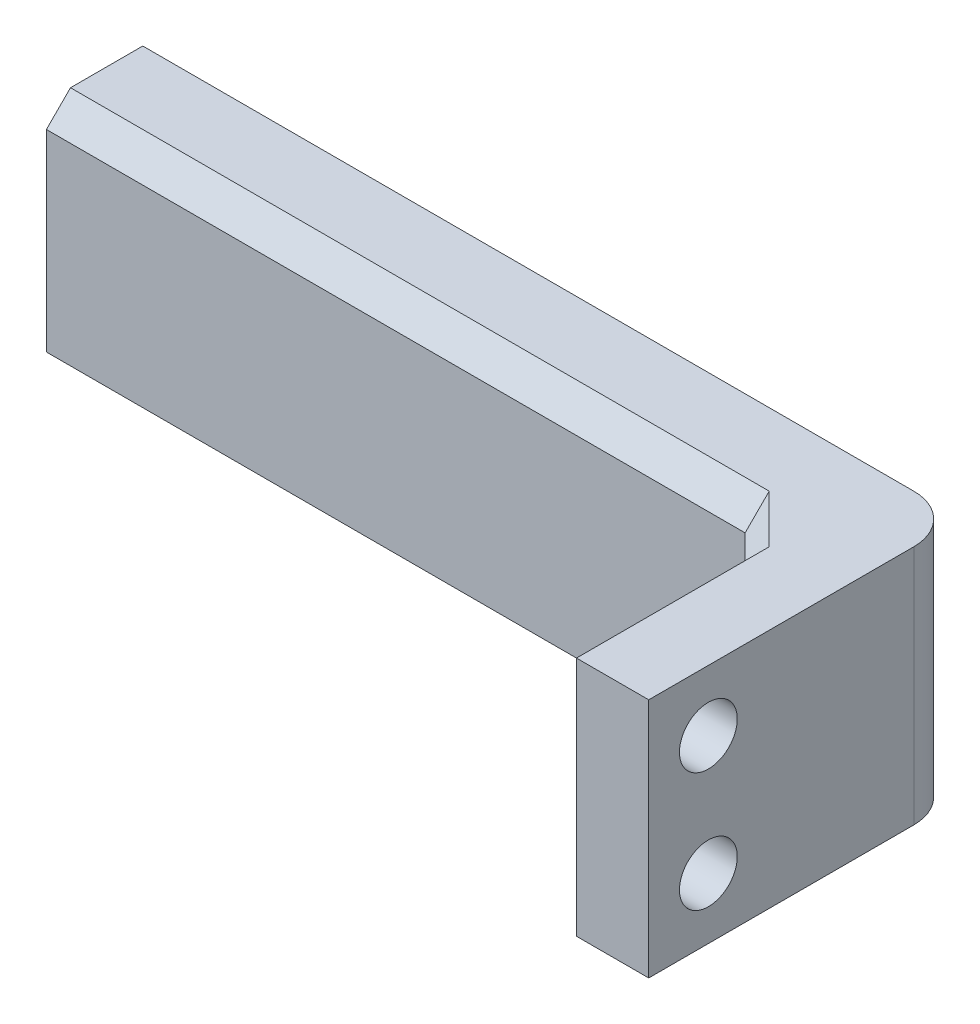
ISO-10303-21;
HEADER;
FILE_DESCRIPTION(('STEP AP214'),'2;1');
FILE_NAME('part.step','',(''),(''),'','','');
FILE_SCHEMA(('AUTOMOTIVE_DESIGN { 1 0 10303 214 1 1 1 1 }'));
ENDSEC;
DATA;
#1=APPLICATION_CONTEXT('core data for automotive mechanical design processes');
#2=APPLICATION_PROTOCOL_DEFINITION('international standard','automotive_design',2000,#1);
#3=PRODUCT_CONTEXT('',#1,'mechanical');
#4=PRODUCT('Part','Part','',(#3));
#5=PRODUCT_RELATED_PRODUCT_CATEGORY('part','',(#4));
#6=PRODUCT_DEFINITION_FORMATION('','',#4);
#7=PRODUCT_DEFINITION_CONTEXT('part definition',#1,'design');
#8=PRODUCT_DEFINITION('design','',#6,#7);
#9=PRODUCT_DEFINITION_SHAPE('','',#8);
#10=(LENGTH_UNIT() NAMED_UNIT(*) SI_UNIT(.MILLI.,.METRE.));
#11=(NAMED_UNIT(*) PLANE_ANGLE_UNIT() SI_UNIT($,.RADIAN.));
#12=(NAMED_UNIT(*) SI_UNIT($,.STERADIAN.) SOLID_ANGLE_UNIT());
#13=UNCERTAINTY_MEASURE_WITH_UNIT(LENGTH_MEASURE(1.E-05),#10,'distance_accuracy_value','');
#14=(GEOMETRIC_REPRESENTATION_CONTEXT(3) GLOBAL_UNCERTAINTY_ASSIGNED_CONTEXT((#13)) GLOBAL_UNIT_ASSIGNED_CONTEXT((#10,
#11,#12)) REPRESENTATION_CONTEXT('',''));
#15=CARTESIAN_POINT('',(0.,0.,0.));
#16=DIRECTION('',(0.,0.,1.));
#17=DIRECTION('',(1.,0.,0.));
#18=AXIS2_PLACEMENT_3D('',#15,#16,#17);
#19=CARTESIAN_POINT('',(0.,2.,0.));
#20=DIRECTION('',(0.,1.,0.));
#21=DIRECTION('',(0.,0.,1.));
#22=AXIS2_PLACEMENT_3D('',#19,#20,#21);
#23=PLANE('',#22);
#24=DIRECTION('',(-1.,0.,0.));
#25=VECTOR('',#24,1.);
#26=CARTESIAN_POINT('',(0.,2.,13.));
#27=LINE('',#26,#25);
#28=CARTESIAN_POINT('',(34.,2.,13.));
#29=VERTEX_POINT('',#28);
#30=CARTESIAN_POINT('',(31.,2.,13.));
#31=VERTEX_POINT('',#30);
#32=EDGE_CURVE('E321',#29,#31,#27,.T.);
#33=ORIENTED_EDGE('',*,*,#32,.T.);
#34=DIRECTION('',(0.,0.,-1.));
#35=VECTOR('',#34,1.);
#36=CARTESIAN_POINT('',(31.,2.,0.));
#37=LINE('',#36,#35);
#38=CARTESIAN_POINT('',(31.,2.,5.));
#39=VERTEX_POINT('',#38);
#40=EDGE_CURVE('E11',#31,#39,#37,.T.);
#41=ORIENTED_EDGE('',*,*,#40,.T.);
#42=DIRECTION('',(0.707106781186549,0.,0.707106781186546));
#43=VECTOR('',#42,1.);
#44=CARTESIAN_POINT('',(31.,2.,5.));
#45=LINE('',#44,#43);
#46=CARTESIAN_POINT('',(30.,2.,4.));
#47=VERTEX_POINT('',#46);
#48=EDGE_CURVE('E52',#47,#39,#45,.T.);
#49=ORIENTED_EDGE('',*,*,#48,.F.);
#50=DIRECTION('',(0.707106781186549,0.,0.707106781186546));
#51=VECTOR('',#50,1.);
#52=CARTESIAN_POINT('',(31.,2.,5.));
#53=LINE('',#52,#51);
#54=CARTESIAN_POINT('',(29.,2.,3.));
#55=VERTEX_POINT('',#54);
#56=EDGE_CURVE('E64',#55,#47,#53,.T.);
#57=ORIENTED_EDGE('',*,*,#56,.F.);
#58=DIRECTION('',(-1.,0.,0.));
#59=VECTOR('',#58,1.);
#60=CARTESIAN_POINT('',(0.,2.,3.));
#61=LINE('',#60,#59);
#62=CARTESIAN_POINT('',(0.,2.,3.));
#63=VERTEX_POINT('',#62);
#64=EDGE_CURVE('E270',#55,#63,#61,.T.);
#65=ORIENTED_EDGE('',*,*,#64,.T.);
#66=DIRECTION('',(0.,0.,1.));
#67=VECTOR('',#66,1.);
#68=CARTESIAN_POINT('',(0.,2.,0.));
#69=LINE('',#68,#67);
#70=CARTESIAN_POINT('',(0.,2.,0.));
#71=VERTEX_POINT('',#70);
#72=EDGE_CURVE('E160',#71,#63,#69,.T.);
#73=ORIENTED_EDGE('',*,*,#72,.F.);
#74=DIRECTION('',(-1.,0.,0.));
#75=VECTOR('',#74,1.);
#76=CARTESIAN_POINT('',(0.,2.,0.));
#77=LINE('',#76,#75);
#78=CARTESIAN_POINT('',(32.,2.,0.));
#79=VERTEX_POINT('',#78);
#80=EDGE_CURVE('E174',#79,#71,#77,.T.);
#81=ORIENTED_EDGE('',*,*,#80,.F.);
#82=CARTESIAN_POINT('',(32.,2.,2.));
#83=DIRECTION('',(0.,1.,0.));
#84=DIRECTION('',(0.,0.,1.));
#85=AXIS2_PLACEMENT_3D('',#82,#83,#84);
#86=CIRCLE('',#85,2.);
#87=CARTESIAN_POINT('',(34.,2.,2.));
#88=VERTEX_POINT('',#87);
#89=EDGE_CURVE('E192',#79,#88,#86,.F.);
#90=ORIENTED_EDGE('',*,*,#89,.T.);
#91=DIRECTION('',(0.,0.,1.));
#92=VECTOR('',#91,1.);
#93=CARTESIAN_POINT('',(34.,2.,0.));
#94=LINE('',#93,#92);
#95=EDGE_CURVE('E325',#88,#29,#94,.T.);
#96=ORIENTED_EDGE('',*,*,#95,.T.);
#97=EDGE_LOOP('',(#33,#41,#49,#57,#65,#73,#81,#90,#96));
#98=FACE_BOUND('',#97,.T.);
#99=ADVANCED_FACE('F41',(#98),#23,.F.);
#100=CARTESIAN_POINT('',(34.,12.,0.));
#101=DIRECTION('',(0.,-1.,0.));
#102=DIRECTION('',(1.,0.,0.));
#103=AXIS2_PLACEMENT_3D('',#100,#101,#102);
#104=PLANE('',#103);
#105=DIRECTION('',(0.,0.,1.));
#106=VECTOR('',#105,1.);
#107=CARTESIAN_POINT('',(0.,12.,0.));
#108=LINE('',#107,#106);
#109=CARTESIAN_POINT('',(0.,12.,0.));
#110=VERTEX_POINT('',#109);
#111=CARTESIAN_POINT('',(0.,12.,3.));
#112=VERTEX_POINT('',#111);
#113=EDGE_CURVE('E153',#110,#112,#108,.T.);
#114=ORIENTED_EDGE('',*,*,#113,.T.);
#115=DIRECTION('',(1.,0.,0.));
#116=VECTOR('',#115,1.);
#117=CARTESIAN_POINT('',(30.,12.,3.));
#118=LINE('',#117,#116);
#119=CARTESIAN_POINT('',(29.,12.,3.));
#120=VERTEX_POINT('',#119);
#121=EDGE_CURVE('E218',#112,#120,#118,.T.);
#122=ORIENTED_EDGE('',*,*,#121,.T.);
#123=DIRECTION('',(-0.707106781186549,0.,-0.707106781186546));
#124=VECTOR('',#123,1.);
#125=CARTESIAN_POINT('',(29.,12.,3.00000000000001));
#126=LINE('',#125,#124);
#127=CARTESIAN_POINT('',(30.,12.,4.));
#128=VERTEX_POINT('',#127);
#129=EDGE_CURVE('E215',#128,#120,#126,.T.);
#130=ORIENTED_EDGE('',*,*,#129,.F.);
#131=DIRECTION('',(-0.707106781186549,0.,-0.707106781186546));
#132=VECTOR('',#131,1.);
#133=CARTESIAN_POINT('',(29.,12.,3.00000000000001));
#134=LINE('',#133,#132);
#135=CARTESIAN_POINT('',(31.,12.,5.));
#136=VERTEX_POINT('',#135);
#137=EDGE_CURVE('E212',#136,#128,#134,.T.);
#138=ORIENTED_EDGE('',*,*,#137,.F.);
#139=DIRECTION('',(0.,0.,1.));
#140=VECTOR('',#139,1.);
#141=CARTESIAN_POINT('',(31.,12.,0.));
#142=LINE('',#141,#140);
#143=CARTESIAN_POINT('',(31.,12.,13.));
#144=VERTEX_POINT('',#143);
#145=EDGE_CURVE('E210',#136,#144,#142,.T.);
#146=ORIENTED_EDGE('',*,*,#145,.T.);
#147=DIRECTION('',(-1.,0.,0.));
#148=VECTOR('',#147,1.);
#149=CARTESIAN_POINT('',(0.,12.,13.));
#150=LINE('',#149,#148);
#151=CARTESIAN_POINT('',(34.,12.,13.));
#152=VERTEX_POINT('',#151);
#153=EDGE_CURVE('E179',#152,#144,#150,.T.);
#154=ORIENTED_EDGE('',*,*,#153,.F.);
#155=DIRECTION('',(0.,0.,1.));
#156=VECTOR('',#155,1.);
#157=CARTESIAN_POINT('',(34.,12.,0.));
#158=LINE('',#157,#156);
#159=CARTESIAN_POINT('',(34.,12.,2.));
#160=VERTEX_POINT('',#159);
#161=EDGE_CURVE('E170',#160,#152,#158,.T.);
#162=ORIENTED_EDGE('',*,*,#161,.F.);
#163=CARTESIAN_POINT('',(32.,12.,2.));
#164=DIRECTION('',(0.,-1.,0.));
#165=DIRECTION('',(1.,0.,0.));
#166=AXIS2_PLACEMENT_3D('',#163,#164,#165);
#167=CIRCLE('',#166,2.);
#168=CARTESIAN_POINT('',(32.,12.,0.));
#169=VERTEX_POINT('',#168);
#170=EDGE_CURVE('E156',#160,#169,#167,.F.);
#171=ORIENTED_EDGE('',*,*,#170,.T.);
#172=DIRECTION('',(1.,0.,0.));
#173=VECTOR('',#172,1.);
#174=CARTESIAN_POINT('',(34.,12.,0.));
#175=LINE('',#174,#173);
#176=EDGE_CURVE('E150',#110,#169,#175,.T.);
#177=ORIENTED_EDGE('',*,*,#176,.F.);
#178=EDGE_LOOP('',(#114,#122,#130,#138,#146,#154,#162,#171,#177));
#179=FACE_BOUND('',#178,.T.);
#180=ADVANCED_FACE('F152',(#179),#104,.F.);
#181=CARTESIAN_POINT('',(34.,0.,4.));
#182=DIRECTION('',(-1.,0.,0.));
#183=DIRECTION('',(0.,0.,1.));
#184=AXIS2_PLACEMENT_3D('',#181,#182,#183);
#185=PLANE('',#184);
#186=CARTESIAN_POINT('',(34.,9.47487373415291,10.5251262658471));
#187=DIRECTION('',(-1.,0.,0.));
#188=DIRECTION('',(0.,0.,1.));
#189=AXIS2_PLACEMENT_3D('',#186,#187,#188);
#190=CIRCLE('',#189,1.2);
#191=CARTESIAN_POINT('',(34.,9.47487373415291,11.7251262658471));
#192=VERTEX_POINT('',#191);
#193=EDGE_CURVE('E308',#192,#192,#190,.T.);
#194=ORIENTED_EDGE('',*,*,#193,.T.);
#195=EDGE_LOOP('',(#194));
#196=FACE_BOUND('',#195,.T.);
#197=CARTESIAN_POINT('',(34.,4.52512626584707,10.5251262658471));
#198=DIRECTION('',(-1.,0.,0.));
#199=DIRECTION('',(0.,0.,1.));
#200=AXIS2_PLACEMENT_3D('',#197,#198,#199);
#201=CIRCLE('',#200,1.2);
#202=CARTESIAN_POINT('',(34.,4.52512626584707,11.7251262658471));
#203=VERTEX_POINT('',#202);
#204=EDGE_CURVE('E319',#203,#203,#201,.T.);
#205=ORIENTED_EDGE('',*,*,#204,.T.);
#206=EDGE_LOOP('',(#205));
#207=FACE_BOUND('',#206,.T.);
#208=ORIENTED_EDGE('',*,*,#95,.F.);
#209=DIRECTION('',(0.,1.,0.));
#210=VECTOR('',#209,1.);
#211=CARTESIAN_POINT('',(34.,0.,2.));
#212=LINE('',#211,#210);
#213=EDGE_CURVE('E186',#88,#160,#212,.T.);
#214=ORIENTED_EDGE('',*,*,#213,.T.);
#215=ORIENTED_EDGE('',*,*,#161,.T.);
#216=DIRECTION('',(0.,1.,0.));
#217=VECTOR('',#216,1.);
#218=CARTESIAN_POINT('',(34.,14.,13.));
#219=LINE('',#218,#217);
#220=EDGE_CURVE('E177',#29,#152,#219,.T.);
#221=ORIENTED_EDGE('',*,*,#220,.F.);
#222=EDGE_LOOP('',(#208,#214,#215,#221));
#223=FACE_BOUND('',#222,.T.);
#224=ADVANCED_FACE('F338',(#196,#207,#223),#185,.F.);
#225=CARTESIAN_POINT('',(0.,0.,4.));
#226=DIRECTION('',(-1.,0.,0.));
#227=DIRECTION('',(0.,0.,1.));
#228=AXIS2_PLACEMENT_3D('',#225,#226,#227);
#229=PLANE('',#228);
#230=DIRECTION('',(0.,1.,0.));
#231=VECTOR('',#230,1.);
#232=CARTESIAN_POINT('',(0.,0.,4.));
#233=LINE('',#232,#231);
#234=CARTESIAN_POINT('',(0.,3.,4.));
#235=VERTEX_POINT('',#234);
#236=CARTESIAN_POINT('',(0.,11.,4.));
#237=VERTEX_POINT('',#236);
#238=EDGE_CURVE('E176',#235,#237,#233,.T.);
#239=ORIENTED_EDGE('',*,*,#238,.T.);
#240=DIRECTION('',(0.,0.70710678118655,-0.707106781186545));
#241=VECTOR('',#240,1.);
#242=CARTESIAN_POINT('',(0.,5.49999999999996,9.49999999999999));
#243=LINE('',#242,#241);
#244=EDGE_CURVE('E169',#237,#112,#243,.T.);
#245=ORIENTED_EDGE('',*,*,#244,.T.);
#246=ORIENTED_EDGE('',*,*,#113,.F.);
#247=DIRECTION('',(0.,1.,0.));
#248=VECTOR('',#247,1.);
#249=CARTESIAN_POINT('',(0.,0.,0.));
#250=LINE('',#249,#248);
#251=EDGE_CURVE('E167',#71,#110,#250,.T.);
#252=ORIENTED_EDGE('',*,*,#251,.F.);
#253=ORIENTED_EDGE('',*,*,#72,.T.);
#254=DIRECTION('',(0.,0.70710678118655,0.707106781186545));
#255=VECTOR('',#254,1.);
#256=CARTESIAN_POINT('',(0.,1.49999999999999,2.5));
#257=LINE('',#256,#255);
#258=EDGE_CURVE('E220',#63,#235,#257,.T.);
#259=ORIENTED_EDGE('',*,*,#258,.T.);
#260=EDGE_LOOP('',(#239,#245,#246,#252,#253,#259));
#261=FACE_BOUND('',#260,.T.);
#262=ADVANCED_FACE('F165',(#261),#229,.T.);
#263=CARTESIAN_POINT('',(0.,0.,4.));
#264=DIRECTION('',(0.,0.,1.));
#265=DIRECTION('',(1.,0.,0.));
#266=AXIS2_PLACEMENT_3D('',#263,#264,#265);
#267=PLANE('',#266);
#268=DIRECTION('',(0.,1.,0.));
#269=VECTOR('',#268,1.);
#270=CARTESIAN_POINT('',(29.,0.,4.));
#271=LINE('',#270,#269);
#272=CARTESIAN_POINT('',(29.,3.,4.));
#273=VERTEX_POINT('',#272);
#274=CARTESIAN_POINT('',(29.,11.,4.));
#275=VERTEX_POINT('',#274);
#276=EDGE_CURVE('E205',#273,#275,#271,.T.);
#277=ORIENTED_EDGE('',*,*,#276,.T.);
#278=DIRECTION('',(-1.,0.,0.));
#279=VECTOR('',#278,1.);
#280=CARTESIAN_POINT('',(0.,11.,4.));
#281=LINE('',#280,#279);
#282=EDGE_CURVE('E208',#275,#237,#281,.T.);
#283=ORIENTED_EDGE('',*,*,#282,.T.);
#284=ORIENTED_EDGE('',*,*,#238,.F.);
#285=DIRECTION('',(1.,0.,0.));
#286=VECTOR('',#285,1.);
#287=CARTESIAN_POINT('',(30.,3.,4.));
#288=LINE('',#287,#286);
#289=EDGE_CURVE('E203',#235,#273,#288,.T.);
#290=ORIENTED_EDGE('',*,*,#289,.T.);
#291=EDGE_LOOP('',(#277,#283,#284,#290));
#292=FACE_BOUND('',#291,.T.);
#293=ADVANCED_FACE('F383',(#292),#267,.T.);
#294=CARTESIAN_POINT('',(0.,0.,0.));
#295=DIRECTION('',(0.,0.,1.));
#296=DIRECTION('',(1.,0.,0.));
#297=AXIS2_PLACEMENT_3D('',#294,#295,#296);
#298=PLANE('',#297);
#299=ORIENTED_EDGE('',*,*,#176,.T.);
#300=DIRECTION('',(0.,1.,0.));
#301=VECTOR('',#300,1.);
#302=CARTESIAN_POINT('',(32.,0.,0.));
#303=LINE('',#302,#301);
#304=EDGE_CURVE('E190',#169,#79,#303,.F.);
#305=ORIENTED_EDGE('',*,*,#304,.T.);
#306=ORIENTED_EDGE('',*,*,#80,.T.);
#307=ORIENTED_EDGE('',*,*,#251,.T.);
#308=EDGE_LOOP('',(#299,#305,#306,#307));
#309=FACE_BOUND('',#308,.T.);
#310=ADVANCED_FACE('F172',(#309),#298,.F.);
#311=CARTESIAN_POINT('',(30.,14.,13.));
#312=DIRECTION('',(1.,0.,0.));
#313=DIRECTION('',(0.,1.,0.));
#314=AXIS2_PLACEMENT_3D('',#311,#312,#313);
#315=PLANE('',#314);
#316=CARTESIAN_POINT('',(30.,4.52512626584707,10.5251262658471));
#317=DIRECTION('',(-1.,0.,0.));
#318=DIRECTION('',(0.,0.,1.));
#319=AXIS2_PLACEMENT_3D('',#316,#317,#318);
#320=CIRCLE('',#319,2.2);
#321=CARTESIAN_POINT('',(30.,6.15753168984746,12.));
#322=VERTEX_POINT('',#321);
#323=CARTESIAN_POINT('',(30.,3.,8.93956962125083));
#324=VERTEX_POINT('',#323);
#325=EDGE_CURVE('E313',#322,#324,#320,.T.);
#326=ORIENTED_EDGE('',*,*,#325,.F.);
#327=DIRECTION('',(0.,1.,0.));
#328=VECTOR('',#327,1.);
#329=CARTESIAN_POINT('',(30.,14.,12.));
#330=LINE('',#329,#328);
#331=CARTESIAN_POINT('',(30.,7.84246831015254,12.));
#332=VERTEX_POINT('',#331);
#333=EDGE_CURVE('E201',#322,#332,#330,.T.);
#334=ORIENTED_EDGE('',*,*,#333,.T.);
#335=CARTESIAN_POINT('',(30.,9.47487373415291,10.5251262658471));
#336=DIRECTION('',(-1.,0.,0.));
#337=DIRECTION('',(0.,0.,1.));
#338=AXIS2_PLACEMENT_3D('',#335,#336,#337);
#339=CIRCLE('',#338,2.2);
#340=CARTESIAN_POINT('',(30.,11.,8.93956962125083));
#341=VERTEX_POINT('',#340);
#342=EDGE_CURVE('E296',#341,#332,#339,.T.);
#343=ORIENTED_EDGE('',*,*,#342,.F.);
#344=DIRECTION('',(0.,0.,-1.));
#345=VECTOR('',#344,1.);
#346=CARTESIAN_POINT('',(30.,11.,13.));
#347=LINE('',#346,#345);
#348=CARTESIAN_POINT('',(30.,11.,5.));
#349=VERTEX_POINT('',#348);
#350=EDGE_CURVE('E199',#341,#349,#347,.T.);
#351=ORIENTED_EDGE('',*,*,#350,.T.);
#352=DIRECTION('',(0.,-1.,0.));
#353=VECTOR('',#352,1.);
#354=CARTESIAN_POINT('',(30.,14.,5.));
#355=LINE('',#354,#353);
#356=CARTESIAN_POINT('',(30.,3.,5.));
#357=VERTEX_POINT('',#356);
#358=EDGE_CURVE('E196',#349,#357,#355,.T.);
#359=ORIENTED_EDGE('',*,*,#358,.T.);
#360=DIRECTION('',(0.,0.,1.));
#361=VECTOR('',#360,1.);
#362=CARTESIAN_POINT('',(30.,3.,13.));
#363=LINE('',#362,#361);
#364=EDGE_CURVE('E194',#357,#324,#363,.T.);
#365=ORIENTED_EDGE('',*,*,#364,.T.);
#366=EDGE_LOOP('',(#326,#334,#343,#351,#359,#365));
#367=FACE_BOUND('',#366,.T.);
#368=ADVANCED_FACE('F345',(#367),#315,.F.);
#369=CARTESIAN_POINT('',(0.,0.,13.));
#370=DIRECTION('',(0.,0.,-1.));
#371=DIRECTION('',(-1.,0.,0.));
#372=AXIS2_PLACEMENT_3D('',#369,#370,#371);
#373=PLANE('',#372);
#374=ORIENTED_EDGE('',*,*,#153,.T.);
#375=DIRECTION('',(0.,-1.,0.));
#376=VECTOR('',#375,1.);
#377=CARTESIAN_POINT('',(31.,0.,13.));
#378=LINE('',#377,#376);
#379=EDGE_CURVE('E337',#144,#31,#378,.T.);
#380=ORIENTED_EDGE('',*,*,#379,.T.);
#381=ORIENTED_EDGE('',*,*,#32,.F.);
#382=ORIENTED_EDGE('',*,*,#220,.T.);
#383=EDGE_LOOP('',(#374,#380,#381,#382));
#384=FACE_BOUND('',#383,.T.);
#385=ADVANCED_FACE('F335',(#384),#373,.F.);
#386=CARTESIAN_POINT('',(30.,4.52512626584707,10.5251262658471));
#387=DIRECTION('',(-1.,0.,0.));
#388=DIRECTION('',(0.,0.,1.));
#389=AXIS2_PLACEMENT_3D('',#386,#387,#388);
#390=CYLINDRICAL_SURFACE('',#389,1.2);
#391=ORIENTED_EDGE('',*,*,#204,.F.);
#392=EDGE_LOOP('',(#391));
#393=FACE_BOUND('',#392,.T.);
#394=CARTESIAN_POINT('',(31.,4.52512626584707,10.5251262658471));
#395=DIRECTION('',(-1.,0.,0.));
#396=DIRECTION('',(0.,0.,1.));
#397=AXIS2_PLACEMENT_3D('',#394,#395,#396);
#398=CIRCLE('',#397,1.2);
#399=CARTESIAN_POINT('',(31.,4.52512626584707,11.7251262658471));
#400=VERTEX_POINT('',#399);
#401=EDGE_CURVE('E316',#400,#400,#398,.T.);
#402=ORIENTED_EDGE('',*,*,#401,.T.);
#403=EDGE_LOOP('',(#402));
#404=FACE_BOUND('',#403,.T.);
#405=ADVANCED_FACE('F252',(#393,#404),#390,.F.);
#406=CARTESIAN_POINT('',(30.,4.52512626584707,10.5251262658471));
#407=DIRECTION('',(-1.,0.,0.));
#408=DIRECTION('',(0.,0.,1.));
#409=AXIS2_PLACEMENT_3D('',#406,#407,#408);
#410=CONICAL_SURFACE('',#409,2.2,0.785398163397448);
#411=ORIENTED_EDGE('',*,*,#401,.F.);
#412=EDGE_LOOP('',(#411));
#413=FACE_BOUND('',#412,.T.);
#414=CARTESIAN_POINT('',(30.,3.,8.93956962125083));
#415=CARTESIAN_POINT('',(30.0374357506839,2.9625642493161,9.02750843035709));
#416=CARTESIAN_POINT('',(30.0726132660143,2.92738673398571,9.11748407822622));
#417=CARTESIAN_POINT('',(30.1376208108882,2.86237918911185,9.30153954243725));
#418=CARTESIAN_POINT('',(30.1674345445712,2.83256545542883,9.3956308209669));
#419=CARTESIAN_POINT('',(30.2206784417451,2.77932155825488,9.58752713676037));
#420=CARTESIAN_POINT('',(30.2441014033268,2.75589859667317,9.68533622350369));
#421=CARTESIAN_POINT('',(30.2835490094259,2.71645099057408,9.88380122117963));
#422=CARTESIAN_POINT('',(30.2995833002603,2.70041669973972,9.98445323715638));
#423=CARTESIAN_POINT('',(30.3204007812237,2.67959921877629,10.1610427508632));
#424=CARTESIAN_POINT('',(30.3270306116629,2.67296938833707,10.2365511100343));
#425=CARTESIAN_POINT('',(30.3356861522452,2.66431384775476,10.3880900985001));
#426=CARTESIAN_POINT('',(30.3377126728331,2.66228732716686,10.4641206334976));
#427=CARTESIAN_POINT('',(30.3371015322884,2.66289846771158,10.6159154058228));
#428=CARTESIAN_POINT('',(30.334477774731,2.665522225269,10.6916797606381));
#429=CARTESIAN_POINT('',(30.3246721504247,2.67532784957531,10.842610678202));
#430=CARTESIAN_POINT('',(30.3174903411429,2.68250965885705,10.917777248475));
#431=CARTESIAN_POINT('',(30.2988035639974,2.7011964360026,11.0667499271059));
#432=CARTESIAN_POINT('',(30.2873138754147,2.71268612458535,11.1405598877687));
#433=CARTESIAN_POINT('',(30.2603057083263,2.73969429167368,11.2867006755664));
#434=CARTESIAN_POINT('',(30.244785683995,2.75521431600497,11.3590309236528));
#435=CARTESIAN_POINT('',(30.1926720073106,2.80732799268941,11.57342676395));
#436=CARTESIAN_POINT('',(30.1505322637112,2.8494677362888,11.7128410005871));
#437=CARTESIAN_POINT('',(30.0803873571348,2.91961264286522,11.9104132030695));
#438=CARTESIAN_POINT('',(30.0569749809201,2.94302501907987,11.9719342185776));
#439=CARTESIAN_POINT('',(30.0324695260966,2.96753047390343,12.0324695260966));
#440=B_SPLINE_CURVE_WITH_KNOTS('',3,(#414,#415,#416,#417,#418,#419,#420,#421,#422,#423,#424,
#425,#426,#427,#428,#429,#430,#431,#432,#433,#434,#435,#436,#437,#438,#439),.UNSPECIFIED.,.F.,
.F.,(4,2,2,2,2,2,2,2,2,2,2,2,4),(0.,0.308015368510683,0.616951281082603,0.926233916082782,
1.23511161349774,1.46311644755483,1.6910811366576,1.91836539773978,2.14564679331799,
2.37212957302993,2.59869934830498,3.05200948161873,3.26143738051654),.UNSPECIFIED.);
#441=CARTESIAN_POINT('',(30.0324695260966,2.96753047390343,12.0324695260966));
#442=VERTEX_POINT('',#441);
#443=EDGE_CURVE('E257',#324,#442,#440,.T.);
#444=ORIENTED_EDGE('',*,*,#443,.T.);
#445=CARTESIAN_POINT('',(30.0324695260966,2.96753047390343,12.0324695260966));
#446=CARTESIAN_POINT('',(30.069174333984,3.05411534728887,12.069174333984));
#447=CARTESIAN_POINT('',(30.1036542496401,3.14269802911238,12.1036542496401));
#448=CARTESIAN_POINT('',(30.1673502183141,3.3238824876254,12.1673502183141));
#449=CARTESIAN_POINT('',(30.1965503829866,3.41649538804112,12.1965503829866));
#450=CARTESIAN_POINT('',(30.2486794523331,3.60537449501888,12.2486794523331));
#451=CARTESIAN_POINT('',(30.2715999088753,3.70164542653848,12.2715999088753));
#452=CARTESIAN_POINT('',(30.3101704337091,3.89696675008095,12.3101704337091));
#453=CARTESIAN_POINT('',(30.3258298964791,3.99601337379186,12.3258298964791));
#454=CARTESIAN_POINT('',(30.3461500058413,4.16999280486668,12.3461500058413));
#455=CARTESIAN_POINT('',(30.3526105569877,4.2445111937654,12.3526105569877));
#456=CARTESIAN_POINT('',(30.3609855950971,4.39405353084547,12.3609855950971));
#457=CARTESIAN_POINT('',(30.3629008749769,4.46907738855804,12.3629008749769));
#458=CARTESIAN_POINT('',(30.3621289338331,4.61883045909021,12.3621289338331));
#459=CARTESIAN_POINT('',(30.3594567476361,4.6935598329569,12.3594567476361));
#460=CARTESIAN_POINT('',(30.3496193606371,4.84241814581704,12.3496193606371));
#461=CARTESIAN_POINT('',(30.3424542640574,4.91654709869809,12.3424542640574));
#462=CARTESIAN_POINT('',(30.3238685744263,5.06342623548192,12.3238685744263));
#463=CARTESIAN_POINT('',(30.3124647578976,5.13618068226508,12.3124647578976));
#464=CARTESIAN_POINT('',(30.2856930098172,5.28022440419246,12.2856930098172));
#465=CARTESIAN_POINT('',(30.2703234275543,5.35151305584079,12.2703234275543));
#466=CARTESIAN_POINT('',(30.2187120565164,5.56297313425243,12.2187120565164));
#467=CARTESIAN_POINT('',(30.1769944133165,5.7005390630411,12.1769944133165));
#468=CARTESIAN_POINT('',(30.1097711448691,5.88933320450354,12.1097711448691));
#469=CARTESIAN_POINT('',(30.0890027905275,5.94411743898365,12.0890027905275));
#470=CARTESIAN_POINT('',(30.0457527686749,6.05200531870745,12.0457527686749));
#471=CARTESIAN_POINT('',(30.0232789061803,6.10511521183844,12.0232789061803));
#472=CARTESIAN_POINT('',(30.,6.15753168984746,12.));
#473=B_SPLINE_CURVE_WITH_KNOTS('',3,(#445,#446,#447,#448,#449,#450,#451,#452,#453,#454,#455,
#456,#457,#458,#459,#460,#461,#462,#463,#464,#465,#466,#467,#468,#469,#470,#471,#472),
.UNSPECIFIED.,.F.,.F.,(4,2,2,2,2,2,2,2,2,2,2,2,2,4),(0.,0.30293428003115,0.606765534321964,
0.911003549802907,1.21484682758178,1.4398190741719,1.66475207174975,1.88894928709848,
2.11314130192361,2.33645527051086,2.55986234172168,3.00728006479364,3.19372211297851,
3.37935716385073),.UNSPECIFIED.);
#474=EDGE_CURVE('E264',#442,#322,#473,.T.);
#475=ORIENTED_EDGE('',*,*,#474,.T.);
#476=ORIENTED_EDGE('',*,*,#325,.T.);
#477=EDGE_LOOP('',(#444,#475,#476));
#478=FACE_BOUND('',#477,.T.);
#479=ADVANCED_FACE('F247',(#413,#478),#410,.F.);
#480=CARTESIAN_POINT('',(30.,9.47487373415291,10.5251262658471));
#481=DIRECTION('',(-1.,0.,0.));
#482=DIRECTION('',(0.,0.,1.));
#483=AXIS2_PLACEMENT_3D('',#480,#481,#482);
#484=CYLINDRICAL_SURFACE('',#483,1.2);
#485=ORIENTED_EDGE('',*,*,#193,.F.);
#486=EDGE_LOOP('',(#485));
#487=FACE_BOUND('',#486,.T.);
#488=CARTESIAN_POINT('',(31.,9.47487373415291,10.5251262658471));
#489=DIRECTION('',(-1.,0.,0.));
#490=DIRECTION('',(0.,0.,1.));
#491=AXIS2_PLACEMENT_3D('',#488,#489,#490);
#492=CIRCLE('',#491,1.2);
#493=CARTESIAN_POINT('',(31.,9.47487373415291,11.7251262658471));
#494=VERTEX_POINT('',#493);
#495=EDGE_CURVE('E302',#494,#494,#492,.T.);
#496=ORIENTED_EDGE('',*,*,#495,.T.);
#497=EDGE_LOOP('',(#496));
#498=FACE_BOUND('',#497,.T.);
#499=ADVANCED_FACE('F242',(#487,#498),#484,.F.);
#500=CARTESIAN_POINT('',(30.,9.47487373415291,10.5251262658471));
#501=DIRECTION('',(-1.,0.,0.));
#502=DIRECTION('',(0.,0.,1.));
#503=AXIS2_PLACEMENT_3D('',#500,#501,#502);
#504=CONICAL_SURFACE('',#503,2.2,0.785398163397448);
#505=ORIENTED_EDGE('',*,*,#495,.F.);
#506=EDGE_LOOP('',(#505));
#507=FACE_BOUND('',#506,.T.);
#508=CARTESIAN_POINT('',(30.,7.84246831015254,12.));
#509=CARTESIAN_POINT('',(30.0392703293578,7.93086788655939,12.0392703293578));
#510=CARTESIAN_POINT('',(30.076289299467,8.02139191402307,12.076289299467));
#511=CARTESIAN_POINT('',(30.1449493488552,8.20679468742116,12.1449493488552));
#512=CARTESIAN_POINT('',(30.1765722698141,8.30168682356207,12.1765722698141));
#513=CARTESIAN_POINT('',(30.2333558601815,8.49556130142595,12.2333558601815));
#514=CARTESIAN_POINT('',(30.2585019591393,8.59455229373549,12.2585019591393));
#515=CARTESIAN_POINT('',(30.3011673194738,8.79566504841804,12.3011673194738));
#516=CARTESIAN_POINT('',(30.3186975740758,8.89778206884586,12.3186975740758));
#517=CARTESIAN_POINT('',(30.3415241249338,9.07476508058939,12.3415241249338));
#518=CARTESIAN_POINT('',(30.348882941173,9.14910679020632,12.348882941173));
#519=CARTESIAN_POINT('',(30.3590833815887,9.29840318587647,12.3590833815887));
#520=CARTESIAN_POINT('',(30.3619259109576,9.37335774606909,12.3619259109576));
#521=CARTESIAN_POINT('',(30.3630069253428,9.52306636754788,12.3630069253428));
#522=CARTESIAN_POINT('',(30.361261696108,9.59782019763718,12.361261696108));
#523=CARTESIAN_POINT('',(30.3532551451183,9.74683635316823,12.3532551451183));
#524=CARTESIAN_POINT('',(30.3469939508128,9.82109869242113,12.3469939508128));
#525=CARTESIAN_POINT('',(30.330160047647,9.96839169096671,12.330160047647));
#526=CARTESIAN_POINT('',(30.3196012250282,10.0414255355806,12.3196012250282));
#527=CARTESIAN_POINT('',(30.2944520809201,10.1860998555135,12.2944520809201));
#528=CARTESIAN_POINT('',(30.2798600427292,10.2577397235694,12.2798600427292));
#529=CARTESIAN_POINT('',(30.2304718303157,10.470312192079,12.2304718303157));
#530=CARTESIAN_POINT('',(30.1900850889622,10.6087205394468,12.1900850889622));
#531=CARTESIAN_POINT('',(30.1267368992635,10.7923456915706,12.1267368992635));
#532=CARTESIAN_POINT('',(30.1088544828879,10.8412722084932,12.1088544828879));
#533=CARTESIAN_POINT('',(30.0716897091979,10.9378005441104,12.0716897091979));
#534=CARTESIAN_POINT('',(30.0524131738821,10.9854068400311,12.0524131738821));
#535=CARTESIAN_POINT('',(30.0324695260966,11.0324695260966,12.0324695260966));
#536=B_SPLINE_CURVE_WITH_KNOTS('',3,(#508,#509,#510,#511,#512,#513,#514,#515,#516,#517,#518,
#519,#520,#521,#522,#523,#524,#525,#526,#527,#528,#529,#530,#531,#532,#533,#534,#535),
.UNSPECIFIED.,.F.,.F.,(4,2,2,2,2,2,2,2,2,2,2,2,2,4),(0.,0.313281674982117,0.627597633281814,
0.942614629075442,1.25717538482362,1.48212322614178,1.70702597581926,1.93113143868094,
2.15523057708913,2.37861129637828,2.60208724244505,3.04957287912209,3.21477558743592,
3.37932432796747),.UNSPECIFIED.);
#537=CARTESIAN_POINT('',(30.0324695260966,11.0324695260966,12.0324695260966));
#538=VERTEX_POINT('',#537);
#539=EDGE_CURVE('E223',#332,#538,#536,.T.);
#540=ORIENTED_EDGE('',*,*,#539,.T.);
#541=CARTESIAN_POINT('',(30.0324695260966,11.0324695260966,12.0324695260966));
#542=CARTESIAN_POINT('',(30.0673381668098,11.0673381668098,11.9463190394729));
#543=CARTESIAN_POINT('',(30.0999739810318,11.0999739810318,11.8582590946834));
#544=CARTESIAN_POINT('',(30.1600106910982,11.1600106910982,11.6783676129093));
#545=CARTESIAN_POINT('',(30.1873974358392,11.1873974358392,11.5865266694352));
#546=CARTESIAN_POINT('',(30.2359784006698,11.2359784006698,11.3995579047648));
#547=CARTESIAN_POINT('',(30.2571710418619,11.2571710418619,11.3044292524189));
#548=CARTESIAN_POINT('',(30.2925034211352,11.2925034211352,11.1116682248628));
#549=CARTESIAN_POINT('',(30.30665134158,11.30665134158,11.0140388934584));
#550=CARTESIAN_POINT('',(30.3248604259336,11.3248604259336,10.8403568946874));
#551=CARTESIAN_POINT('',(30.3305117348089,11.3305117348089,10.7646329209259));
#552=CARTESIAN_POINT('',(30.3371787174334,11.3371787174334,10.6127809314454));
#553=CARTESIAN_POINT('',(30.3381950785244,11.3381950785244,10.5366529773114));
#554=CARTESIAN_POINT('',(30.3355647514528,11.3355647514528,10.3847672194968));
#555=CARTESIAN_POINT('',(30.3319306788833,11.3319306788833,10.3090089716746));
#556=CARTESIAN_POINT('',(30.3201296804356,11.3201296804356,10.1582077058781));
#557=CARTESIAN_POINT('',(30.3119627818699,11.3119627818699,10.0831646835968));
#558=CARTESIAN_POINT('',(30.2913670625897,11.2913670625897,9.93459562520387));
#559=CARTESIAN_POINT('',(30.2789565169972,11.2789565169972,9.86106449443586));
#560=CARTESIAN_POINT('',(30.2501780250292,11.2501780250292,9.7155572912098));
#561=CARTESIAN_POINT('',(30.2338086239775,11.2338086239775,9.64358180098469));
#562=CARTESIAN_POINT('',(30.1792645168983,11.1792645168983,9.4303118907678));
#563=CARTESIAN_POINT('',(30.1356661182336,11.1356661182336,9.29175733604108));
#564=CARTESIAN_POINT('',(30.0592252230909,11.0592252230909,9.08350921226686));
#565=CARTESIAN_POINT('',(30.0303476841543,11.0303476841543,9.0108393414797));
#566=CARTESIAN_POINT('',(30.,11.,8.93956962125083));
#567=B_SPLINE_CURVE_WITH_KNOTS('',3,(#541,#542,#543,#544,#545,#546,#547,#548,#549,#550,#551,
#552,#553,#554,#555,#556,#557,#558,#559,#560,#561,#562,#563,#564,#565,#566),.UNSPECIFIED.,.F.,
.F.,(4,2,2,2,2,2,2,2,2,2,2,2,4),(0.,0.297861130381362,0.59651431267175,0.895243556387211,
1.19362501535844,1.42179329718273,1.6499277415902,1.87744461789746,2.10496012332466,
2.33150792944764,2.55813910707847,3.01165415788614,3.26146308125678),.UNSPECIFIED.);
#568=EDGE_CURVE('E230',#538,#341,#567,.T.);
#569=ORIENTED_EDGE('',*,*,#568,.T.);
#570=ORIENTED_EDGE('',*,*,#342,.T.);
#571=EDGE_LOOP('',(#540,#569,#570));
#572=FACE_BOUND('',#571,.T.);
#573=ADVANCED_FACE('F237',(#507,#572),#504,.F.);
#574=CARTESIAN_POINT('',(32.,0.,2.));
#575=DIRECTION('',(0.,1.,0.));
#576=DIRECTION('',(0.,0.,1.));
#577=AXIS2_PLACEMENT_3D('',#574,#575,#576);
#578=CYLINDRICAL_SURFACE('',#577,2.);
#579=ORIENTED_EDGE('',*,*,#89,.F.);
#580=ORIENTED_EDGE('',*,*,#304,.F.);
#581=ORIENTED_EDGE('',*,*,#170,.F.);
#582=ORIENTED_EDGE('',*,*,#213,.F.);
#583=EDGE_LOOP('',(#579,#580,#581,#582));
#584=FACE_BOUND('',#583,.T.);
#585=ADVANCED_FACE('F241',(#584),#578,.T.);
#586=CARTESIAN_POINT('',(31.,0.,13.));
#587=DIRECTION('',(0.707106781186549,0.,-0.707106781186546));
#588=DIRECTION('',(0.,-1.,0.));
#589=AXIS2_PLACEMENT_3D('',#586,#587,#588);
#590=PLANE('',#589);
#591=DIRECTION('',(-0.577350269189624,0.577350269189627,-0.577350269189626));
#592=VECTOR('',#591,1.);
#593=CARTESIAN_POINT('',(30.3333333333333,2.66666666666667,12.3333333333333));
#594=LINE('',#593,#592);
#595=EDGE_CURVE('E290',#31,#442,#594,.T.);
#596=ORIENTED_EDGE('',*,*,#595,.F.);
#597=ORIENTED_EDGE('',*,*,#379,.F.);
#598=DIRECTION('',(-0.577350269189627,-0.577350269189622,-0.577350269189629));
#599=VECTOR('',#598,1.);
#600=CARTESIAN_POINT('',(27.,8.00000000000006,9.00000000000001));
#601=LINE('',#600,#599);
#602=EDGE_CURVE('E47',#538,#144,#601,.F.);
#603=ORIENTED_EDGE('',*,*,#602,.F.);
#604=ORIENTED_EDGE('',*,*,#539,.F.);
#605=ORIENTED_EDGE('',*,*,#333,.F.);
#606=ORIENTED_EDGE('',*,*,#474,.F.);
#607=EDGE_LOOP('',(#596,#597,#603,#604,#605,#606));
#608=FACE_BOUND('',#607,.T.);
#609=ADVANCED_FACE('F44',(#608),#590,.F.);
#610=CARTESIAN_POINT('',(34.,12.,3.));
#611=DIRECTION('',(0.,0.707106781186545,0.70710678118655));
#612=DIRECTION('',(-1.,0.,0.));
#613=AXIS2_PLACEMENT_3D('',#610,#611,#612);
#614=PLANE('',#613);
#615=ORIENTED_EDGE('',*,*,#244,.F.);
#616=ORIENTED_EDGE('',*,*,#282,.F.);
#617=DIRECTION('',(0.,-0.70710678118655,0.707106781186545));
#618=VECTOR('',#617,1.);
#619=CARTESIAN_POINT('',(29.,12.,3.));
#620=LINE('',#619,#618);
#621=EDGE_CURVE('E288',#120,#275,#620,.T.);
#622=ORIENTED_EDGE('',*,*,#621,.F.);
#623=ORIENTED_EDGE('',*,*,#121,.F.);
#624=EDGE_LOOP('',(#615,#616,#622,#623));
#625=FACE_BOUND('',#624,.T.);
#626=ADVANCED_FACE('F370',(#625),#614,.T.);
#627=CARTESIAN_POINT('',(30.,11.,13.));
#628=DIRECTION('',(0.707106781186544,-0.707106781186551,0.));
#629=DIRECTION('',(0.,0.,-1.));
#630=AXIS2_PLACEMENT_3D('',#627,#628,#629);
#631=PLANE('',#630);
#632=ORIENTED_EDGE('',*,*,#602,.T.);
#633=ORIENTED_EDGE('',*,*,#145,.F.);
#634=DIRECTION('',(0.707106781186551,0.707106781186544,0.));
#635=VECTOR('',#634,1.);
#636=CARTESIAN_POINT('',(30.,11.,5.));
#637=LINE('',#636,#635);
#638=EDGE_CURVE('E285',#349,#136,#637,.T.);
#639=ORIENTED_EDGE('',*,*,#638,.F.);
#640=ORIENTED_EDGE('',*,*,#350,.F.);
#641=ORIENTED_EDGE('',*,*,#568,.F.);
#642=EDGE_LOOP('',(#632,#633,#639,#640,#641));
#643=FACE_BOUND('',#642,.T.);
#644=ADVANCED_FACE('F348',(#643),#631,.F.);
#645=CARTESIAN_POINT('',(30.,3.,13.));
#646=DIRECTION('',(0.707106781186549,0.707106781186545,0.));
#647=DIRECTION('',(0.,0.,1.));
#648=AXIS2_PLACEMENT_3D('',#645,#646,#647);
#649=PLANE('',#648);
#650=ORIENTED_EDGE('',*,*,#443,.F.);
#651=ORIENTED_EDGE('',*,*,#364,.F.);
#652=DIRECTION('',(-0.707106781186545,0.70710678118655,0.));
#653=VECTOR('',#652,1.);
#654=CARTESIAN_POINT('',(31.,2.,5.));
#655=LINE('',#654,#653);
#656=EDGE_CURVE('E282',#39,#357,#655,.T.);
#657=ORIENTED_EDGE('',*,*,#656,.F.);
#658=ORIENTED_EDGE('',*,*,#40,.F.);
#659=ORIENTED_EDGE('',*,*,#595,.T.);
#660=EDGE_LOOP('',(#650,#651,#657,#658,#659));
#661=FACE_BOUND('',#660,.T.);
#662=ADVANCED_FACE('F361',(#661),#649,.F.);
#663=CARTESIAN_POINT('',(0.,2.,3.));
#664=DIRECTION('',(0.,-0.707106781186545,0.70710678118655));
#665=DIRECTION('',(1.,0.,0.));
#666=AXIS2_PLACEMENT_3D('',#663,#664,#665);
#667=PLANE('',#666);
#668=ORIENTED_EDGE('',*,*,#258,.F.);
#669=ORIENTED_EDGE('',*,*,#64,.F.);
#670=DIRECTION('',(0.,-0.70710678118655,-0.707106781186545));
#671=VECTOR('',#670,1.);
#672=CARTESIAN_POINT('',(29.,3.,4.));
#673=LINE('',#672,#671);
#674=EDGE_CURVE('E279',#273,#55,#673,.T.);
#675=ORIENTED_EDGE('',*,*,#674,.F.);
#676=ORIENTED_EDGE('',*,*,#289,.F.);
#677=EDGE_LOOP('',(#668,#669,#675,#676));
#678=FACE_BOUND('',#677,.T.);
#679=ADVANCED_FACE('F363',(#678),#667,.T.);
#680=CARTESIAN_POINT('',(29.,11.,4.));
#681=DIRECTION('',(-0.577350269189629,0.577350269189622,0.577350269189626));
#682=DIRECTION('',(0.707106781186546,0.,0.707106781186549));
#683=AXIS2_PLACEMENT_3D('',#680,#681,#682);
#684=PLANE('',#683);
#685=ORIENTED_EDGE('',*,*,#129,.T.);
#686=ORIENTED_EDGE('',*,*,#621,.T.);
#687=DIRECTION('',(0.707106781186549,0.,0.707106781186546));
#688=VECTOR('',#687,1.);
#689=CARTESIAN_POINT('',(29.,11.,4.));
#690=LINE('',#689,#688);
#691=EDGE_CURVE('E277',#349,#275,#690,.F.);
#692=ORIENTED_EDGE('',*,*,#691,.F.);
#693=ORIENTED_EDGE('',*,*,#638,.T.);
#694=ORIENTED_EDGE('',*,*,#137,.T.);
#695=EDGE_LOOP('',(#685,#686,#692,#693,#694));
#696=FACE_BOUND('',#695,.T.);
#697=ADVANCED_FACE('F352',(#696),#684,.T.);
#698=CARTESIAN_POINT('',(30.,3.,5.));
#699=DIRECTION('',(-0.577350269189626,-0.577350269189623,0.577350269189628));
#700=DIRECTION('',(0.707106781186549,0.,0.707106781186546));
#701=AXIS2_PLACEMENT_3D('',#698,#699,#700);
#702=PLANE('',#701);
#703=ORIENTED_EDGE('',*,*,#48,.T.);
#704=ORIENTED_EDGE('',*,*,#656,.T.);
#705=DIRECTION('',(-0.707106781186549,0.,-0.707106781186546));
#706=VECTOR('',#705,1.);
#707=CARTESIAN_POINT('',(30.,3.,5.));
#708=LINE('',#707,#706);
#709=EDGE_CURVE('E275',#273,#357,#708,.F.);
#710=ORIENTED_EDGE('',*,*,#709,.F.);
#711=ORIENTED_EDGE('',*,*,#674,.T.);
#712=ORIENTED_EDGE('',*,*,#56,.T.);
#713=EDGE_LOOP('',(#703,#704,#710,#711,#712));
#714=FACE_BOUND('',#713,.T.);
#715=ADVANCED_FACE('F403',(#714),#702,.T.);
#716=CARTESIAN_POINT('',(30.,14.,5.));
#717=DIRECTION('',(0.707106781186546,0.,-0.707106781186549));
#718=DIRECTION('',(0.,-1.,0.));
#719=AXIS2_PLACEMENT_3D('',#716,#717,#718);
#720=PLANE('',#719);
#721=ORIENTED_EDGE('',*,*,#691,.T.);
#722=ORIENTED_EDGE('',*,*,#276,.F.);
#723=ORIENTED_EDGE('',*,*,#709,.T.);
#724=ORIENTED_EDGE('',*,*,#358,.F.);
#725=EDGE_LOOP('',(#721,#722,#723,#724));
#726=FACE_BOUND('',#725,.T.);
#727=ADVANCED_FACE('F357',(#726),#720,.F.);
#728=CLOSED_SHELL('',(#99,#180,#224,#262,#293,#310,#368,#385,#405,#479,#499,#573,#585,#609,#626,
#644,#662,#679,#697,#715,#727));
#729=MANIFOLD_SOLID_BREP('B2',#728);
#730=ADVANCED_BREP_SHAPE_REPRESENTATION('',(#18,#729),#14);
#731=SHAPE_DEFINITION_REPRESENTATION(#9,#730);
ENDSEC;
END-ISO-10303-21;
